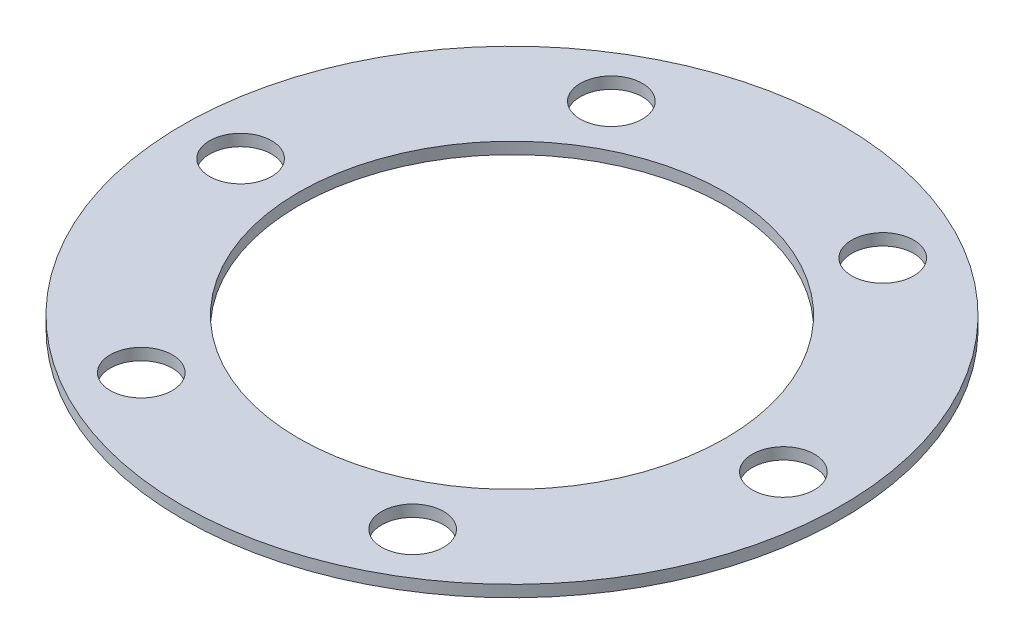
ISO-10303-21;
HEADER;
FILE_DESCRIPTION(('STEP AP214'),'2;1');
FILE_NAME('part.step','',(''),(''),'','','');
FILE_SCHEMA(('AUTOMOTIVE_DESIGN { 1 0 10303 214 1 1 1 1 }'));
ENDSEC;
DATA;
#1=APPLICATION_CONTEXT('core data for automotive mechanical design processes');
#2=APPLICATION_PROTOCOL_DEFINITION('international standard','automotive_design',2000,#1);
#3=PRODUCT_CONTEXT('',#1,'mechanical');
#4=PRODUCT('Part','Part','',(#3));
#5=PRODUCT_RELATED_PRODUCT_CATEGORY('part','',(#4));
#6=PRODUCT_DEFINITION_FORMATION('','',#4);
#7=PRODUCT_DEFINITION_CONTEXT('part definition',#1,'design');
#8=PRODUCT_DEFINITION('design','',#6,#7);
#9=PRODUCT_DEFINITION_SHAPE('','',#8);
#10=(LENGTH_UNIT() NAMED_UNIT(*) SI_UNIT(.MILLI.,.METRE.));
#11=(NAMED_UNIT(*) PLANE_ANGLE_UNIT() SI_UNIT($,.RADIAN.));
#12=(NAMED_UNIT(*) SI_UNIT($,.STERADIAN.) SOLID_ANGLE_UNIT());
#13=UNCERTAINTY_MEASURE_WITH_UNIT(LENGTH_MEASURE(1.E-05),#10,'distance_accuracy_value','');
#14=(GEOMETRIC_REPRESENTATION_CONTEXT(3) GLOBAL_UNCERTAINTY_ASSIGNED_CONTEXT((#13)) GLOBAL_UNIT_ASSIGNED_CONTEXT((#10,
#11,#12)) REPRESENTATION_CONTEXT('',''));
#15=CARTESIAN_POINT('',(0.,0.,0.));
#16=DIRECTION('',(0.,0.,1.));
#17=DIRECTION('',(1.,0.,0.));
#18=AXIS2_PLACEMENT_3D('',#15,#16,#17);
#19=CARTESIAN_POINT('',(0.,1.5,0.));
#20=DIRECTION('',(0.,1.,0.));
#21=DIRECTION('',(0.,0.,1.));
#22=AXIS2_PLACEMENT_3D('',#19,#20,#21);
#23=PLANE('',#22);
#24=CARTESIAN_POINT('',(70.,1.5,0.));
#25=DIRECTION('',(0.,1.,0.));
#26=DIRECTION('',(0.,0.,1.));
#27=AXIS2_PLACEMENT_3D('',#24,#25,#26);
#28=CIRCLE('',#27,8.);
#29=CARTESIAN_POINT('',(70.,1.5,8.));
#30=VERTEX_POINT('',#29);
#31=EDGE_CURVE('E79',#30,#30,#28,.T.);
#32=ORIENTED_EDGE('',*,*,#31,.F.);
#33=EDGE_LOOP('',(#32));
#34=FACE_BOUND('',#33,.T.);
#35=CARTESIAN_POINT('',(35.,1.5,-60.6217782649107));
#36=DIRECTION('',(0.,1.,0.));
#37=DIRECTION('',(0.,0.,1.));
#38=AXIS2_PLACEMENT_3D('',#35,#36,#37);
#39=CIRCLE('',#38,7.99999999999998);
#40=CARTESIAN_POINT('',(35.,1.5,-52.6217782649108));
#41=VERTEX_POINT('',#40);
#42=EDGE_CURVE('E58',#41,#41,#39,.T.);
#43=ORIENTED_EDGE('',*,*,#42,.F.);
#44=EDGE_LOOP('',(#43));
#45=FACE_BOUND('',#44,.T.);
#46=CARTESIAN_POINT('',(-35.,1.5,-60.6217782649107));
#47=DIRECTION('',(0.,1.,0.));
#48=DIRECTION('',(0.,0.,1.));
#49=AXIS2_PLACEMENT_3D('',#46,#47,#48);
#50=CIRCLE('',#49,7.99999999999999);
#51=CARTESIAN_POINT('',(-35.,1.5,-52.6217782649107));
#52=VERTEX_POINT('',#51);
#53=EDGE_CURVE('E57',#52,#52,#50,.T.);
#54=ORIENTED_EDGE('',*,*,#53,.F.);
#55=EDGE_LOOP('',(#54));
#56=FACE_BOUND('',#55,.T.);
#57=CARTESIAN_POINT('',(-70.,1.5,0.));
#58=DIRECTION('',(0.,1.,0.));
#59=DIRECTION('',(0.,0.,1.));
#60=AXIS2_PLACEMENT_3D('',#57,#58,#59);
#61=CIRCLE('',#60,7.99999999999999);
#62=CARTESIAN_POINT('',(-70.,1.5,8.));
#63=VERTEX_POINT('',#62);
#64=EDGE_CURVE('E64',#63,#63,#61,.T.);
#65=ORIENTED_EDGE('',*,*,#64,.F.);
#66=EDGE_LOOP('',(#65));
#67=FACE_BOUND('',#66,.T.);
#68=CARTESIAN_POINT('',(-35.,1.5,60.6217782649107));
#69=DIRECTION('',(0.,1.,0.));
#70=DIRECTION('',(0.,0.,1.));
#71=AXIS2_PLACEMENT_3D('',#68,#69,#70);
#72=CIRCLE('',#71,8.);
#73=CARTESIAN_POINT('',(-35.,1.5,68.6217782649107));
#74=VERTEX_POINT('',#73);
#75=EDGE_CURVE('E70',#74,#74,#72,.T.);
#76=ORIENTED_EDGE('',*,*,#75,.F.);
#77=EDGE_LOOP('',(#76));
#78=FACE_BOUND('',#77,.T.);
#79=CARTESIAN_POINT('',(35.,1.5,60.6217782649107));
#80=DIRECTION('',(0.,1.,0.));
#81=DIRECTION('',(0.,0.,1.));
#82=AXIS2_PLACEMENT_3D('',#79,#80,#81);
#83=CIRCLE('',#82,8.00000000000001);
#84=CARTESIAN_POINT('',(35.,1.5,68.6217782649107));
#85=VERTEX_POINT('',#84);
#86=EDGE_CURVE('E76',#85,#85,#83,.T.);
#87=ORIENTED_EDGE('',*,*,#86,.F.);
#88=EDGE_LOOP('',(#87));
#89=FACE_BOUND('',#88,.T.);
#90=CARTESIAN_POINT('',(0.,1.5,0.));
#91=DIRECTION('',(0.,1.,0.));
#92=DIRECTION('',(0.,0.,1.));
#93=AXIS2_PLACEMENT_3D('',#90,#91,#92);
#94=CIRCLE('',#93,85.);
#95=CARTESIAN_POINT('',(0.,1.5,85.));
#96=VERTEX_POINT('',#95);
#97=EDGE_CURVE('E10',#96,#96,#94,.T.);
#98=ORIENTED_EDGE('',*,*,#97,.T.);
#99=EDGE_LOOP('',(#98));
#100=FACE_BOUND('',#99,.T.);
#101=CARTESIAN_POINT('',(0.,1.5,0.));
#102=DIRECTION('',(0.,1.,0.));
#103=DIRECTION('',(0.,0.,1.));
#104=AXIS2_PLACEMENT_3D('',#101,#102,#103);
#105=CIRCLE('',#104,55.);
#106=CARTESIAN_POINT('',(0.,1.5,55.));
#107=VERTEX_POINT('',#106);
#108=EDGE_CURVE('E46',#107,#107,#105,.T.);
#109=ORIENTED_EDGE('',*,*,#108,.F.);
#110=EDGE_LOOP('',(#109));
#111=FACE_BOUND('',#110,.T.);
#112=ADVANCED_FACE('F35',(#34,#45,#56,#67,#78,#89,#100,#111),#23,.T.);
#113=CARTESIAN_POINT('',(0.,-1.5,0.));
#114=DIRECTION('',(0.,1.,0.));
#115=DIRECTION('',(0.,0.,1.));
#116=AXIS2_PLACEMENT_3D('',#113,#114,#115);
#117=PLANE('',#116);
#118=CARTESIAN_POINT('',(70.,-1.5,0.));
#119=DIRECTION('',(0.,1.,0.));
#120=DIRECTION('',(0.,0.,1.));
#121=AXIS2_PLACEMENT_3D('',#118,#119,#120);
#122=CIRCLE('',#121,8.);
#123=CARTESIAN_POINT('',(70.,-1.5,8.));
#124=VERTEX_POINT('',#123);
#125=EDGE_CURVE('E51',#124,#124,#122,.T.);
#126=ORIENTED_EDGE('',*,*,#125,.T.);
#127=EDGE_LOOP('',(#126));
#128=FACE_BOUND('',#127,.T.);
#129=CARTESIAN_POINT('',(35.,-1.5,-60.6217782649107));
#130=DIRECTION('',(0.,1.,0.));
#131=DIRECTION('',(0.,0.,1.));
#132=AXIS2_PLACEMENT_3D('',#129,#130,#131);
#133=CIRCLE('',#132,7.99999999999998);
#134=CARTESIAN_POINT('',(35.,-1.5,-52.6217782649108));
#135=VERTEX_POINT('',#134);
#136=EDGE_CURVE('E80',#135,#135,#133,.T.);
#137=ORIENTED_EDGE('',*,*,#136,.T.);
#138=EDGE_LOOP('',(#137));
#139=FACE_BOUND('',#138,.T.);
#140=CARTESIAN_POINT('',(-35.,-1.5,-60.6217782649107));
#141=DIRECTION('',(0.,1.,0.));
#142=DIRECTION('',(0.,0.,1.));
#143=AXIS2_PLACEMENT_3D('',#140,#141,#142);
#144=CIRCLE('',#143,7.99999999999999);
#145=CARTESIAN_POINT('',(-35.,-1.5,-52.6217782649107));
#146=VERTEX_POINT('',#145);
#147=EDGE_CURVE('E54',#146,#146,#144,.T.);
#148=ORIENTED_EDGE('',*,*,#147,.T.);
#149=EDGE_LOOP('',(#148));
#150=FACE_BOUND('',#149,.T.);
#151=CARTESIAN_POINT('',(-70.,-1.5,0.));
#152=DIRECTION('',(0.,1.,0.));
#153=DIRECTION('',(0.,0.,1.));
#154=AXIS2_PLACEMENT_3D('',#151,#152,#153);
#155=CIRCLE('',#154,7.99999999999999);
#156=CARTESIAN_POINT('',(-70.,-1.5,8.));
#157=VERTEX_POINT('',#156);
#158=EDGE_CURVE('E61',#157,#157,#155,.T.);
#159=ORIENTED_EDGE('',*,*,#158,.T.);
#160=EDGE_LOOP('',(#159));
#161=FACE_BOUND('',#160,.T.);
#162=CARTESIAN_POINT('',(-35.,-1.5,60.6217782649107));
#163=DIRECTION('',(0.,1.,0.));
#164=DIRECTION('',(0.,0.,1.));
#165=AXIS2_PLACEMENT_3D('',#162,#163,#164);
#166=CIRCLE('',#165,8.);
#167=CARTESIAN_POINT('',(-35.,-1.5,68.6217782649107));
#168=VERTEX_POINT('',#167);
#169=EDGE_CURVE('E67',#168,#168,#166,.T.);
#170=ORIENTED_EDGE('',*,*,#169,.T.);
#171=EDGE_LOOP('',(#170));
#172=FACE_BOUND('',#171,.T.);
#173=CARTESIAN_POINT('',(35.,-1.5,60.6217782649107));
#174=DIRECTION('',(0.,1.,0.));
#175=DIRECTION('',(0.,0.,1.));
#176=AXIS2_PLACEMENT_3D('',#173,#174,#175);
#177=CIRCLE('',#176,8.00000000000001);
#178=CARTESIAN_POINT('',(35.,-1.5,68.6217782649107));
#179=VERTEX_POINT('',#178);
#180=EDGE_CURVE('E73',#179,#179,#177,.T.);
#181=ORIENTED_EDGE('',*,*,#180,.T.);
#182=EDGE_LOOP('',(#181));
#183=FACE_BOUND('',#182,.T.);
#184=CARTESIAN_POINT('',(0.,-1.5,0.));
#185=DIRECTION('',(0.,1.,0.));
#186=DIRECTION('',(0.,0.,1.));
#187=AXIS2_PLACEMENT_3D('',#184,#185,#186);
#188=CIRCLE('',#187,85.);
#189=CARTESIAN_POINT('',(0.,-1.5,85.));
#190=VERTEX_POINT('',#189);
#191=EDGE_CURVE('E39',#190,#190,#188,.T.);
#192=ORIENTED_EDGE('',*,*,#191,.F.);
#193=EDGE_LOOP('',(#192));
#194=FACE_BOUND('',#193,.T.);
#195=CARTESIAN_POINT('',(0.,-1.5,0.));
#196=DIRECTION('',(0.,1.,0.));
#197=DIRECTION('',(0.,0.,1.));
#198=AXIS2_PLACEMENT_3D('',#195,#196,#197);
#199=CIRCLE('',#198,55.);
#200=CARTESIAN_POINT('',(0.,-1.5,55.));
#201=VERTEX_POINT('',#200);
#202=EDGE_CURVE('E48',#201,#201,#199,.T.);
#203=ORIENTED_EDGE('',*,*,#202,.T.);
#204=EDGE_LOOP('',(#203));
#205=FACE_BOUND('',#204,.T.);
#206=ADVANCED_FACE('F90',(#128,#139,#150,#161,#172,#183,#194,#205),#117,.F.);
#207=CARTESIAN_POINT('',(0.,1.5,0.));
#208=DIRECTION('',(0.,-1.,0.));
#209=DIRECTION('',(0.,0.,-1.));
#210=AXIS2_PLACEMENT_3D('',#207,#208,#209);
#211=CYLINDRICAL_SURFACE('',#210,85.);
#212=ORIENTED_EDGE('',*,*,#97,.F.);
#213=EDGE_LOOP('',(#212));
#214=FACE_BOUND('',#213,.T.);
#215=ORIENTED_EDGE('',*,*,#191,.T.);
#216=EDGE_LOOP('',(#215));
#217=FACE_BOUND('',#216,.T.);
#218=ADVANCED_FACE('F37',(#214,#217),#211,.T.);
#219=CARTESIAN_POINT('',(0.,1.5,0.));
#220=DIRECTION('',(0.,-1.,0.));
#221=DIRECTION('',(0.,0.,-1.));
#222=AXIS2_PLACEMENT_3D('',#219,#220,#221);
#223=CYLINDRICAL_SURFACE('',#222,55.);
#224=ORIENTED_EDGE('',*,*,#108,.T.);
#225=EDGE_LOOP('',(#224));
#226=FACE_BOUND('',#225,.T.);
#227=ORIENTED_EDGE('',*,*,#202,.F.);
#228=EDGE_LOOP('',(#227));
#229=FACE_BOUND('',#228,.T.);
#230=ADVANCED_FACE('F115',(#226,#229),#223,.F.);
#231=CARTESIAN_POINT('',(35.,-1.5,60.6217782649107));
#232=DIRECTION('',(0.,1.,0.));
#233=DIRECTION('',(0.,0.,1.));
#234=AXIS2_PLACEMENT_3D('',#231,#232,#233);
#235=CYLINDRICAL_SURFACE('',#234,8.00000000000001);
#236=ORIENTED_EDGE('',*,*,#180,.F.);
#237=EDGE_LOOP('',(#236));
#238=FACE_BOUND('',#237,.T.);
#239=ORIENTED_EDGE('',*,*,#86,.T.);
#240=EDGE_LOOP('',(#239));
#241=FACE_BOUND('',#240,.T.);
#242=ADVANCED_FACE('F118',(#238,#241),#235,.F.);
#243=CARTESIAN_POINT('',(-35.,-1.5,60.6217782649107));
#244=DIRECTION('',(0.,1.,0.));
#245=DIRECTION('',(0.,0.,1.));
#246=AXIS2_PLACEMENT_3D('',#243,#244,#245);
#247=CYLINDRICAL_SURFACE('',#246,8.);
#248=ORIENTED_EDGE('',*,*,#169,.F.);
#249=EDGE_LOOP('',(#248));
#250=FACE_BOUND('',#249,.T.);
#251=ORIENTED_EDGE('',*,*,#75,.T.);
#252=EDGE_LOOP('',(#251));
#253=FACE_BOUND('',#252,.T.);
#254=ADVANCED_FACE('F135',(#250,#253),#247,.F.);
#255=CARTESIAN_POINT('',(-70.,-1.5,0.));
#256=DIRECTION('',(0.,1.,0.));
#257=DIRECTION('',(0.,0.,1.));
#258=AXIS2_PLACEMENT_3D('',#255,#256,#257);
#259=CYLINDRICAL_SURFACE('',#258,7.99999999999999);
#260=ORIENTED_EDGE('',*,*,#158,.F.);
#261=EDGE_LOOP('',(#260));
#262=FACE_BOUND('',#261,.T.);
#263=ORIENTED_EDGE('',*,*,#64,.T.);
#264=EDGE_LOOP('',(#263));
#265=FACE_BOUND('',#264,.T.);
#266=ADVANCED_FACE('F131',(#262,#265),#259,.F.);
#267=CARTESIAN_POINT('',(-35.,-1.5,-60.6217782649107));
#268=DIRECTION('',(0.,1.,0.));
#269=DIRECTION('',(0.,0.,1.));
#270=AXIS2_PLACEMENT_3D('',#267,#268,#269);
#271=CYLINDRICAL_SURFACE('',#270,7.99999999999999);
#272=ORIENTED_EDGE('',*,*,#147,.F.);
#273=EDGE_LOOP('',(#272));
#274=FACE_BOUND('',#273,.T.);
#275=ORIENTED_EDGE('',*,*,#53,.T.);
#276=EDGE_LOOP('',(#275));
#277=FACE_BOUND('',#276,.T.);
#278=ADVANCED_FACE('F128',(#274,#277),#271,.F.);
#279=CARTESIAN_POINT('',(35.,-1.5,-60.6217782649107));
#280=DIRECTION('',(0.,1.,0.));
#281=DIRECTION('',(0.,0.,1.));
#282=AXIS2_PLACEMENT_3D('',#279,#280,#281);
#283=CYLINDRICAL_SURFACE('',#282,7.99999999999998);
#284=ORIENTED_EDGE('',*,*,#136,.F.);
#285=EDGE_LOOP('',(#284));
#286=FACE_BOUND('',#285,.T.);
#287=ORIENTED_EDGE('',*,*,#42,.T.);
#288=EDGE_LOOP('',(#287));
#289=FACE_BOUND('',#288,.T.);
#290=ADVANCED_FACE('F96',(#286,#289),#283,.F.);
#291=CARTESIAN_POINT('',(70.,-1.5,0.));
#292=DIRECTION('',(0.,1.,0.));
#293=DIRECTION('',(0.,0.,1.));
#294=AXIS2_PLACEMENT_3D('',#291,#292,#293);
#295=CYLINDRICAL_SURFACE('',#294,8.);
#296=ORIENTED_EDGE('',*,*,#125,.F.);
#297=EDGE_LOOP('',(#296));
#298=FACE_BOUND('',#297,.T.);
#299=ORIENTED_EDGE('',*,*,#31,.T.);
#300=EDGE_LOOP('',(#299));
#301=FACE_BOUND('',#300,.T.);
#302=ADVANCED_FACE('F93',(#298,#301),#295,.F.);
#303=CLOSED_SHELL('',(#112,#206,#218,#230,#242,#254,#266,#278,#290,#302));
#304=MANIFOLD_SOLID_BREP('B2',#303);
#305=ADVANCED_BREP_SHAPE_REPRESENTATION('',(#18,#304),#14);
#306=SHAPE_DEFINITION_REPRESENTATION(#9,#305);
ENDSEC;
END-ISO-10303-21;
